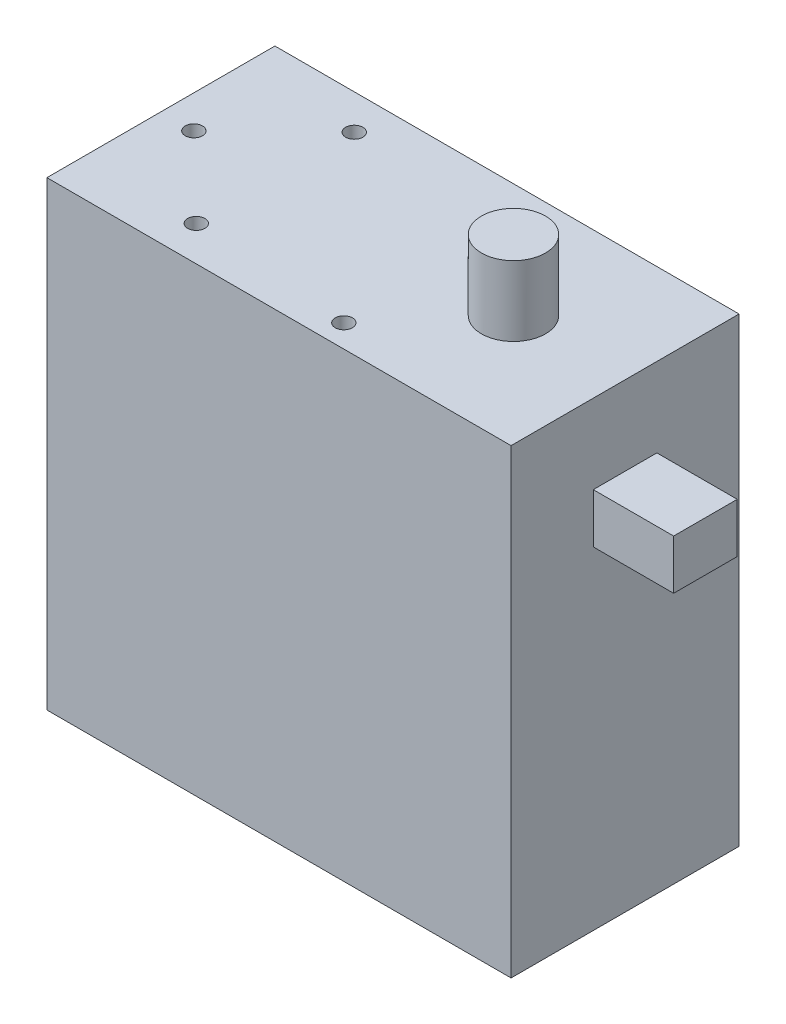
ISO-10303-21;
HEADER;
FILE_DESCRIPTION(('STEP AP214'),'2;1');
FILE_NAME('part.step','',(''),(''),'','','');
FILE_SCHEMA(('AUTOMOTIVE_DESIGN { 1 0 10303 214 1 1 1 1 }'));
ENDSEC;
DATA;
#1=APPLICATION_CONTEXT('core data for automotive mechanical design processes');
#2=APPLICATION_PROTOCOL_DEFINITION('international standard','automotive_design',2000,#1);
#3=PRODUCT_CONTEXT('',#1,'mechanical');
#4=PRODUCT('Part','Part','',(#3));
#5=PRODUCT_RELATED_PRODUCT_CATEGORY('part','',(#4));
#6=PRODUCT_DEFINITION_FORMATION('','',#4);
#7=PRODUCT_DEFINITION_CONTEXT('part definition',#1,'design');
#8=PRODUCT_DEFINITION('design','',#6,#7);
#9=PRODUCT_DEFINITION_SHAPE('','',#8);
#10=(LENGTH_UNIT() NAMED_UNIT(*) SI_UNIT(.MILLI.,.METRE.));
#11=(NAMED_UNIT(*) PLANE_ANGLE_UNIT() SI_UNIT($,.RADIAN.));
#12=(NAMED_UNIT(*) SI_UNIT($,.STERADIAN.) SOLID_ANGLE_UNIT());
#13=UNCERTAINTY_MEASURE_WITH_UNIT(LENGTH_MEASURE(1.E-05),#10,'distance_accuracy_value','');
#14=(GEOMETRIC_REPRESENTATION_CONTEXT(3) GLOBAL_UNCERTAINTY_ASSIGNED_CONTEXT((#13)) GLOBAL_UNIT_ASSIGNED_CONTEXT((#10,
#11,#12)) REPRESENTATION_CONTEXT('',''));
#15=CARTESIAN_POINT('',(0.,0.,0.));
#16=DIRECTION('',(0.,0.,1.));
#17=DIRECTION('',(1.,0.,0.));
#18=AXIS2_PLACEMENT_3D('',#15,#16,#17);
#19=CARTESIAN_POINT('',(40.43,0.,19.86));
#20=DIRECTION('',(-1.,0.,0.));
#21=DIRECTION('',(0.,0.,1.));
#22=AXIS2_PLACEMENT_3D('',#19,#20,#21);
#23=PLANE('',#22);
#24=DIRECTION('',(0.,1.,0.));
#25=VECTOR('',#24,1.);
#26=CARTESIAN_POINT('',(40.43,0.,0.));
#27=LINE('',#26,#25);
#28=CARTESIAN_POINT('',(40.43,0.,0.));
#29=VERTEX_POINT('',#28);
#30=CARTESIAN_POINT('',(40.43,40.16,0.));
#31=VERTEX_POINT('',#30);
#32=EDGE_CURVE('E212',#29,#31,#27,.T.);
#33=ORIENTED_EDGE('',*,*,#32,.T.);
#34=DIRECTION('',(0.,0.,-1.));
#35=VECTOR('',#34,1.);
#36=CARTESIAN_POINT('',(40.43,40.16,19.86));
#37=LINE('',#36,#35);
#38=CARTESIAN_POINT('',(40.43,40.16,19.86));
#39=VERTEX_POINT('',#38);
#40=EDGE_CURVE('E217',#39,#31,#37,.T.);
#41=ORIENTED_EDGE('',*,*,#40,.F.);
#42=DIRECTION('',(0.,1.,0.));
#43=VECTOR('',#42,1.);
#44=CARTESIAN_POINT('',(40.43,0.,19.86));
#45=LINE('',#44,#43);
#46=CARTESIAN_POINT('',(40.43,0.,19.86));
#47=VERTEX_POINT('',#46);
#48=EDGE_CURVE('E203',#47,#39,#45,.T.);
#49=ORIENTED_EDGE('',*,*,#48,.F.);
#50=DIRECTION('',(0.,0.,-1.));
#51=VECTOR('',#50,1.);
#52=CARTESIAN_POINT('',(40.43,0.,19.86));
#53=LINE('',#52,#51);
#54=EDGE_CURVE('E220',#47,#29,#53,.T.);
#55=ORIENTED_EDGE('',*,*,#54,.T.);
#56=EDGE_LOOP('',(#33,#41,#49,#55));
#57=FACE_BOUND('',#56,.T.);
#58=DIRECTION('',(0.,-1.,0.));
#59=VECTOR('',#58,1.);
#60=CARTESIAN_POINT('',(40.43,33.26,12.7));
#61=LINE('',#60,#59);
#62=CARTESIAN_POINT('',(40.43,33.26,12.7));
#63=VERTEX_POINT('',#62);
#64=CARTESIAN_POINT('',(40.43,28.94,12.7));
#65=VERTEX_POINT('',#64);
#66=EDGE_CURVE('E118',#63,#65,#61,.T.);
#67=ORIENTED_EDGE('',*,*,#66,.F.);
#68=DIRECTION('',(0.,0.,1.));
#69=VECTOR('',#68,1.);
#70=CARTESIAN_POINT('',(40.43,33.26,12.7));
#71=LINE('',#70,#69);
#72=CARTESIAN_POINT('',(40.43,33.26,7.16));
#73=VERTEX_POINT('',#72);
#74=EDGE_CURVE('E115',#73,#63,#71,.T.);
#75=ORIENTED_EDGE('',*,*,#74,.F.);
#76=DIRECTION('',(0.,1.,0.));
#77=VECTOR('',#76,1.);
#78=CARTESIAN_POINT('',(40.43,33.26,7.16));
#79=LINE('',#78,#77);
#80=CARTESIAN_POINT('',(40.43,28.94,7.16));
#81=VERTEX_POINT('',#80);
#82=EDGE_CURVE('E53',#81,#73,#79,.T.);
#83=ORIENTED_EDGE('',*,*,#82,.F.);
#84=DIRECTION('',(0.,0.,-1.));
#85=VECTOR('',#84,1.);
#86=CARTESIAN_POINT('',(40.43,28.94,12.7));
#87=LINE('',#86,#85);
#88=EDGE_CURVE('E48',#65,#81,#87,.T.);
#89=ORIENTED_EDGE('',*,*,#88,.F.);
#90=EDGE_LOOP('',(#67,#75,#83,#89));
#91=FACE_BOUND('',#90,.T.);
#92=ADVANCED_FACE('F33',(#57,#91),#23,.F.);
#93=CARTESIAN_POINT('',(0.,0.,19.86));
#94=DIRECTION('',(1.,0.,0.));
#95=DIRECTION('',(0.,0.,-1.));
#96=AXIS2_PLACEMENT_3D('',#93,#94,#95);
#97=PLANE('',#96);
#98=DIRECTION('',(0.,-1.,0.));
#99=VECTOR('',#98,1.);
#100=CARTESIAN_POINT('',(0.,0.,0.));
#101=LINE('',#100,#99);
#102=CARTESIAN_POINT('',(0.,40.16,0.));
#103=VERTEX_POINT('',#102);
#104=CARTESIAN_POINT('',(0.,0.,0.));
#105=VERTEX_POINT('',#104);
#106=EDGE_CURVE('E196',#103,#105,#101,.T.);
#107=ORIENTED_EDGE('',*,*,#106,.T.);
#108=DIRECTION('',(0.,0.,-1.));
#109=VECTOR('',#108,1.);
#110=CARTESIAN_POINT('',(0.,0.,19.86));
#111=LINE('',#110,#109);
#112=CARTESIAN_POINT('',(0.,0.,19.86));
#113=VERTEX_POINT('',#112);
#114=EDGE_CURVE('E223',#113,#105,#111,.T.);
#115=ORIENTED_EDGE('',*,*,#114,.F.);
#116=DIRECTION('',(0.,-1.,0.));
#117=VECTOR('',#116,1.);
#118=CARTESIAN_POINT('',(0.,0.,19.86));
#119=LINE('',#118,#117);
#120=CARTESIAN_POINT('',(0.,40.16,19.86));
#121=VERTEX_POINT('',#120);
#122=EDGE_CURVE('E197',#121,#113,#119,.T.);
#123=ORIENTED_EDGE('',*,*,#122,.F.);
#124=DIRECTION('',(0.,0.,-1.));
#125=VECTOR('',#124,1.);
#126=CARTESIAN_POINT('',(0.,40.16,19.86));
#127=LINE('',#126,#125);
#128=EDGE_CURVE('E207',#121,#103,#127,.T.);
#129=ORIENTED_EDGE('',*,*,#128,.T.);
#130=EDGE_LOOP('',(#107,#115,#123,#129));
#131=FACE_BOUND('',#130,.T.);
#132=ADVANCED_FACE('F35',(#131),#97,.F.);
#133=CARTESIAN_POINT('',(0.,0.,19.86));
#134=DIRECTION('',(0.,1.,0.));
#135=DIRECTION('',(0.,0.,1.));
#136=AXIS2_PLACEMENT_3D('',#133,#134,#135);
#137=PLANE('',#136);
#138=CARTESIAN_POINT('',(38.43,0.,17.86));
#139=DIRECTION('',(0.,-1.,0.));
#140=DIRECTION('',(0.,0.,-1.));
#141=AXIS2_PLACEMENT_3D('',#138,#139,#140);
#142=CIRCLE('',#141,0.749999999999999);
#143=CARTESIAN_POINT('',(38.43,0.,17.11));
#144=VERTEX_POINT('',#143);
#145=EDGE_CURVE('E135',#144,#144,#142,.T.);
#146=ORIENTED_EDGE('',*,*,#145,.F.);
#147=EDGE_LOOP('',(#146));
#148=FACE_BOUND('',#147,.T.);
#149=CARTESIAN_POINT('',(2.07,0.,17.86));
#150=DIRECTION('',(0.,-1.,0.));
#151=DIRECTION('',(0.,0.,-1.));
#152=AXIS2_PLACEMENT_3D('',#149,#150,#151);
#153=CIRCLE('',#152,0.750000000000001);
#154=CARTESIAN_POINT('',(2.07,0.,17.11));
#155=VERTEX_POINT('',#154);
#156=EDGE_CURVE('E141',#155,#155,#153,.T.);
#157=ORIENTED_EDGE('',*,*,#156,.F.);
#158=EDGE_LOOP('',(#157));
#159=FACE_BOUND('',#158,.T.);
#160=CARTESIAN_POINT('',(17.31,0.,2.));
#161=DIRECTION('',(0.,-1.,0.));
#162=DIRECTION('',(0.,0.,-1.));
#163=AXIS2_PLACEMENT_3D('',#160,#161,#162);
#164=CIRCLE('',#163,0.750000000000002);
#165=CARTESIAN_POINT('',(17.31,0.,1.25));
#166=VERTEX_POINT('',#165);
#167=EDGE_CURVE('E147',#166,#166,#164,.T.);
#168=ORIENTED_EDGE('',*,*,#167,.F.);
#169=EDGE_LOOP('',(#168));
#170=FACE_BOUND('',#169,.T.);
#171=CARTESIAN_POINT('',(38.43,0.,2.));
#172=DIRECTION('',(0.,-1.,0.));
#173=DIRECTION('',(0.,0.,-1.));
#174=AXIS2_PLACEMENT_3D('',#171,#172,#173);
#175=CIRCLE('',#174,0.749999999999999);
#176=CARTESIAN_POINT('',(38.43,0.,1.25));
#177=VERTEX_POINT('',#176);
#178=EDGE_CURVE('E129',#177,#177,#175,.T.);
#179=ORIENTED_EDGE('',*,*,#178,.F.);
#180=EDGE_LOOP('',(#179));
#181=FACE_BOUND('',#180,.T.);
#182=CARTESIAN_POINT('',(2.07,0.,2.));
#183=DIRECTION('',(0.,-1.,0.));
#184=DIRECTION('',(0.,0.,-1.));
#185=AXIS2_PLACEMENT_3D('',#182,#183,#184);
#186=CIRCLE('',#185,0.750000000000001);
#187=CARTESIAN_POINT('',(2.07,0.,1.25));
#188=VERTEX_POINT('',#187);
#189=EDGE_CURVE('E119',#188,#188,#186,.T.);
#190=ORIENTED_EDGE('',*,*,#189,.F.);
#191=EDGE_LOOP('',(#190));
#192=FACE_BOUND('',#191,.T.);
#193=CARTESIAN_POINT('',(17.31,0.,17.86));
#194=DIRECTION('',(0.,-1.,0.));
#195=DIRECTION('',(0.,0.,-1.));
#196=AXIS2_PLACEMENT_3D('',#193,#194,#195);
#197=CIRCLE('',#196,0.750000000000002);
#198=CARTESIAN_POINT('',(17.31,0.,17.11));
#199=VERTEX_POINT('',#198);
#200=EDGE_CURVE('E134',#199,#199,#197,.T.);
#201=ORIENTED_EDGE('',*,*,#200,.F.);
#202=EDGE_LOOP('',(#201));
#203=FACE_BOUND('',#202,.T.);
#204=CARTESIAN_POINT('',(30.71,0.,9.93));
#205=DIRECTION('',(0.,1.,0.));
#206=DIRECTION('',(0.,0.,1.));
#207=AXIS2_PLACEMENT_3D('',#204,#205,#206);
#208=CIRCLE('',#207,3.01);
#209=CARTESIAN_POINT('',(30.71,0.,12.94));
#210=VERTEX_POINT('',#209);
#211=EDGE_CURVE('E11',#210,#210,#208,.F.);
#212=ORIENTED_EDGE('',*,*,#211,.F.);
#213=EDGE_LOOP('',(#212));
#214=FACE_BOUND('',#213,.T.);
#215=DIRECTION('',(1.,0.,0.));
#216=VECTOR('',#215,1.);
#217=CARTESIAN_POINT('',(0.,0.,0.));
#218=LINE('',#217,#216);
#219=EDGE_CURVE('E210',#105,#29,#218,.T.);
#220=ORIENTED_EDGE('',*,*,#219,.T.);
#221=ORIENTED_EDGE('',*,*,#54,.F.);
#222=DIRECTION('',(1.,0.,0.));
#223=VECTOR('',#222,1.);
#224=CARTESIAN_POINT('',(0.,0.,19.86));
#225=LINE('',#224,#223);
#226=EDGE_CURVE('E200',#113,#47,#225,.T.);
#227=ORIENTED_EDGE('',*,*,#226,.F.);
#228=ORIENTED_EDGE('',*,*,#114,.T.);
#229=EDGE_LOOP('',(#220,#221,#227,#228));
#230=FACE_BOUND('',#229,.T.);
#231=ADVANCED_FACE('F234',(#148,#159,#170,#181,#192,#203,#214,#230),#137,.F.);
#232=CARTESIAN_POINT('',(0.,40.16,19.86));
#233=DIRECTION('',(0.,-1.,0.));
#234=DIRECTION('',(0.,0.,-1.));
#235=AXIS2_PLACEMENT_3D('',#232,#233,#234);
#236=PLANE('',#235);
#237=CARTESIAN_POINT('',(23.88,40.16,17.88));
#238=DIRECTION('',(0.,1.,0.));
#239=DIRECTION('',(0.,0.,1.));
#240=AXIS2_PLACEMENT_3D('',#237,#238,#239);
#241=CIRCLE('',#240,0.750000000000002);
#242=CARTESIAN_POINT('',(23.88,40.16,18.63));
#243=VERTEX_POINT('',#242);
#244=EDGE_CURVE('E177',#243,#243,#241,.T.);
#245=ORIENTED_EDGE('',*,*,#244,.F.);
#246=EDGE_LOOP('',(#245));
#247=FACE_BOUND('',#246,.T.);
#248=CARTESIAN_POINT('',(2.87,40.16,9.93));
#249=DIRECTION('',(0.,1.,0.));
#250=DIRECTION('',(0.,0.,1.));
#251=AXIS2_PLACEMENT_3D('',#248,#249,#250);
#252=CIRCLE('',#251,0.750000000000001);
#253=CARTESIAN_POINT('',(2.87,40.16,10.68));
#254=VERTEX_POINT('',#253);
#255=EDGE_CURVE('E164',#254,#254,#252,.T.);
#256=ORIENTED_EDGE('',*,*,#255,.F.);
#257=EDGE_LOOP('',(#256));
#258=FACE_BOUND('',#257,.T.);
#259=CARTESIAN_POINT('',(9.96,40.16,3.05));
#260=DIRECTION('',(0.,1.,0.));
#261=DIRECTION('',(0.,0.,1.));
#262=AXIS2_PLACEMENT_3D('',#259,#260,#261);
#263=CIRCLE('',#262,0.75);
#264=CARTESIAN_POINT('',(9.96,40.16,3.8));
#265=VERTEX_POINT('',#264);
#266=EDGE_CURVE('E165',#265,#265,#263,.T.);
#267=ORIENTED_EDGE('',*,*,#266,.F.);
#268=EDGE_LOOP('',(#267));
#269=FACE_BOUND('',#268,.T.);
#270=CARTESIAN_POINT('',(9.96,40.16,16.81));
#271=DIRECTION('',(0.,1.,0.));
#272=DIRECTION('',(0.,0.,1.));
#273=AXIS2_PLACEMENT_3D('',#270,#271,#272);
#274=CIRCLE('',#273,0.75);
#275=CARTESIAN_POINT('',(9.96,40.16,17.56));
#276=VERTEX_POINT('',#275);
#277=EDGE_CURVE('E158',#276,#276,#274,.T.);
#278=ORIENTED_EDGE('',*,*,#277,.F.);
#279=EDGE_LOOP('',(#278));
#280=FACE_BOUND('',#279,.T.);
#281=CARTESIAN_POINT('',(23.88,40.16,1.98));
#282=DIRECTION('',(0.,1.,0.));
#283=DIRECTION('',(0.,0.,1.));
#284=AXIS2_PLACEMENT_3D('',#281,#282,#283);
#285=CIRCLE('',#284,0.750000000000002);
#286=CARTESIAN_POINT('',(23.88,40.16,2.73));
#287=VERTEX_POINT('',#286);
#288=EDGE_CURVE('E176',#287,#287,#285,.T.);
#289=ORIENTED_EDGE('',*,*,#288,.F.);
#290=EDGE_LOOP('',(#289));
#291=FACE_BOUND('',#290,.T.);
#292=CARTESIAN_POINT('',(30.71,40.16,9.93));
#293=DIRECTION('',(0.,-1.,0.));
#294=DIRECTION('',(0.,0.,-1.));
#295=AXIS2_PLACEMENT_3D('',#292,#293,#294);
#296=CIRCLE('',#295,2.79);
#297=CARTESIAN_POINT('',(30.71,40.16,7.14));
#298=VERTEX_POINT('',#297);
#299=EDGE_CURVE('E41',#298,#298,#296,.F.);
#300=ORIENTED_EDGE('',*,*,#299,.F.);
#301=EDGE_LOOP('',(#300));
#302=FACE_BOUND('',#301,.T.);
#303=DIRECTION('',(-1.,0.,0.));
#304=VECTOR('',#303,1.);
#305=CARTESIAN_POINT('',(0.,40.16,0.));
#306=LINE('',#305,#304);
#307=EDGE_CURVE('E201',#31,#103,#306,.T.);
#308=ORIENTED_EDGE('',*,*,#307,.T.);
#309=ORIENTED_EDGE('',*,*,#128,.F.);
#310=DIRECTION('',(-1.,0.,0.));
#311=VECTOR('',#310,1.);
#312=CARTESIAN_POINT('',(0.,40.16,19.86));
#313=LINE('',#312,#311);
#314=EDGE_CURVE('E205',#39,#121,#313,.T.);
#315=ORIENTED_EDGE('',*,*,#314,.F.);
#316=ORIENTED_EDGE('',*,*,#40,.T.);
#317=EDGE_LOOP('',(#308,#309,#315,#316));
#318=FACE_BOUND('',#317,.T.);
#319=ADVANCED_FACE('F230',(#247,#258,#269,#280,#291,#302,#318),#236,.F.);
#320=CARTESIAN_POINT('',(0.,0.,19.86));
#321=DIRECTION('',(0.,0.,-1.));
#322=DIRECTION('',(-1.,0.,0.));
#323=AXIS2_PLACEMENT_3D('',#320,#321,#322);
#324=PLANE('',#323);
#325=ORIENTED_EDGE('',*,*,#122,.T.);
#326=ORIENTED_EDGE('',*,*,#226,.T.);
#327=ORIENTED_EDGE('',*,*,#48,.T.);
#328=ORIENTED_EDGE('',*,*,#314,.T.);
#329=EDGE_LOOP('',(#325,#326,#327,#328));
#330=FACE_BOUND('',#329,.T.);
#331=ADVANCED_FACE('F233',(#330),#324,.F.);
#332=CARTESIAN_POINT('',(0.,0.,0.));
#333=DIRECTION('',(0.,0.,-1.));
#334=DIRECTION('',(-1.,0.,0.));
#335=AXIS2_PLACEMENT_3D('',#332,#333,#334);
#336=PLANE('',#335);
#337=ORIENTED_EDGE('',*,*,#106,.F.);
#338=ORIENTED_EDGE('',*,*,#307,.F.);
#339=ORIENTED_EDGE('',*,*,#32,.F.);
#340=ORIENTED_EDGE('',*,*,#219,.F.);
#341=EDGE_LOOP('',(#337,#338,#339,#340));
#342=FACE_BOUND('',#341,.T.);
#343=ADVANCED_FACE('F247',(#342),#336,.T.);
#344=CARTESIAN_POINT('',(30.71,46.26,9.93));
#345=DIRECTION('',(0.,-1.,0.));
#346=DIRECTION('',(0.,0.,-1.));
#347=AXIS2_PLACEMENT_3D('',#344,#345,#346);
#348=CYLINDRICAL_SURFACE('',#347,2.79);
#349=CARTESIAN_POINT('',(30.71,46.26,9.93));
#350=DIRECTION('',(0.,1.,0.));
#351=DIRECTION('',(0.,0.,1.));
#352=AXIS2_PLACEMENT_3D('',#349,#350,#351);
#353=CIRCLE('',#352,2.79);
#354=CARTESIAN_POINT('',(30.71,46.26,12.72));
#355=VERTEX_POINT('',#354);
#356=EDGE_CURVE('E193',#355,#355,#353,.T.);
#357=ORIENTED_EDGE('',*,*,#356,.F.);
#358=EDGE_LOOP('',(#357));
#359=FACE_BOUND('',#358,.T.);
#360=ORIENTED_EDGE('',*,*,#299,.T.);
#361=EDGE_LOOP('',(#360));
#362=FACE_BOUND('',#361,.T.);
#363=ADVANCED_FACE('F228',(#359,#362),#348,.T.);
#364=CARTESIAN_POINT('',(30.71,46.26,9.93));
#365=DIRECTION('',(0.,1.,0.));
#366=DIRECTION('',(0.,0.,1.));
#367=AXIS2_PLACEMENT_3D('',#364,#365,#366);
#368=PLANE('',#367);
#369=ORIENTED_EDGE('',*,*,#356,.T.);
#370=EDGE_LOOP('',(#369));
#371=FACE_BOUND('',#370,.T.);
#372=ADVANCED_FACE('F377',(#371),#368,.T.);
#373=CARTESIAN_POINT('',(30.71,-5.5,9.93));
#374=DIRECTION('',(0.,1.,0.));
#375=DIRECTION('',(0.,0.,1.));
#376=AXIS2_PLACEMENT_3D('',#373,#374,#375);
#377=CYLINDRICAL_SURFACE('',#376,3.01);
#378=CARTESIAN_POINT('',(30.71,-5.5,9.93));
#379=DIRECTION('',(0.,-1.,0.));
#380=DIRECTION('',(0.,0.,-1.));
#381=AXIS2_PLACEMENT_3D('',#378,#379,#380);
#382=CIRCLE('',#381,3.01);
#383=CARTESIAN_POINT('',(30.71,-5.5,6.92));
#384=VERTEX_POINT('',#383);
#385=EDGE_CURVE('E188',#384,#384,#382,.T.);
#386=ORIENTED_EDGE('',*,*,#385,.F.);
#387=EDGE_LOOP('',(#386));
#388=FACE_BOUND('',#387,.T.);
#389=ORIENTED_EDGE('',*,*,#211,.T.);
#390=EDGE_LOOP('',(#389));
#391=FACE_BOUND('',#390,.T.);
#392=ADVANCED_FACE('F373',(#388,#391),#377,.T.);
#393=CARTESIAN_POINT('',(30.71,-5.5,9.93));
#394=DIRECTION('',(0.,-1.,0.));
#395=DIRECTION('',(0.,0.,-1.));
#396=AXIS2_PLACEMENT_3D('',#393,#394,#395);
#397=PLANE('',#396);
#398=ORIENTED_EDGE('',*,*,#385,.T.);
#399=EDGE_LOOP('',(#398));
#400=FACE_BOUND('',#399,.T.);
#401=ADVANCED_FACE('F369',(#400),#397,.T.);
#402=CARTESIAN_POINT('',(23.88,38.16,1.98));
#403=DIRECTION('',(0.,1.,0.));
#404=DIRECTION('',(0.,0.,1.));
#405=AXIS2_PLACEMENT_3D('',#402,#403,#404);
#406=CYLINDRICAL_SURFACE('',#405,0.750000000000002);
#407=CARTESIAN_POINT('',(23.88,38.16,1.98));
#408=DIRECTION('',(0.,1.,0.));
#409=DIRECTION('',(0.,0.,1.));
#410=AXIS2_PLACEMENT_3D('',#407,#408,#409);
#411=CIRCLE('',#410,0.750000000000002);
#412=CARTESIAN_POINT('',(23.88,38.16,2.73));
#413=VERTEX_POINT('',#412);
#414=EDGE_CURVE('E185',#413,#413,#411,.T.);
#415=ORIENTED_EDGE('',*,*,#414,.F.);
#416=EDGE_LOOP('',(#415));
#417=FACE_BOUND('',#416,.T.);
#418=ORIENTED_EDGE('',*,*,#288,.T.);
#419=EDGE_LOOP('',(#418));
#420=FACE_BOUND('',#419,.T.);
#421=ADVANCED_FACE('F365',(#417,#420),#406,.F.);
#422=CARTESIAN_POINT('',(23.88,38.16,1.98));
#423=DIRECTION('',(0.,1.,0.));
#424=DIRECTION('',(0.,0.,1.));
#425=AXIS2_PLACEMENT_3D('',#422,#423,#424);
#426=PLANE('',#425);
#427=ORIENTED_EDGE('',*,*,#414,.T.);
#428=EDGE_LOOP('',(#427));
#429=FACE_BOUND('',#428,.T.);
#430=ADVANCED_FACE('F347',(#429),#426,.T.);
#431=CARTESIAN_POINT('',(9.96,38.16,16.81));
#432=DIRECTION('',(0.,1.,0.));
#433=DIRECTION('',(0.,0.,1.));
#434=AXIS2_PLACEMENT_3D('',#431,#432,#433);
#435=CYLINDRICAL_SURFACE('',#434,0.75);
#436=CARTESIAN_POINT('',(9.96,38.16,16.81));
#437=DIRECTION('',(0.,1.,0.));
#438=DIRECTION('',(0.,0.,1.));
#439=AXIS2_PLACEMENT_3D('',#436,#437,#438);
#440=CIRCLE('',#439,0.75);
#441=CARTESIAN_POINT('',(9.96,38.16,17.56));
#442=VERTEX_POINT('',#441);
#443=EDGE_CURVE('E168',#442,#442,#440,.T.);
#444=ORIENTED_EDGE('',*,*,#443,.F.);
#445=EDGE_LOOP('',(#444));
#446=FACE_BOUND('',#445,.T.);
#447=ORIENTED_EDGE('',*,*,#277,.T.);
#448=EDGE_LOOP('',(#447));
#449=FACE_BOUND('',#448,.T.);
#450=ADVANCED_FACE('F343',(#446,#449),#435,.F.);
#451=CARTESIAN_POINT('',(9.96,38.16,16.81));
#452=DIRECTION('',(0.,1.,0.));
#453=DIRECTION('',(0.,0.,1.));
#454=AXIS2_PLACEMENT_3D('',#451,#452,#453);
#455=PLANE('',#454);
#456=ORIENTED_EDGE('',*,*,#443,.T.);
#457=EDGE_LOOP('',(#456));
#458=FACE_BOUND('',#457,.T.);
#459=ADVANCED_FACE('F339',(#458),#455,.T.);
#460=CARTESIAN_POINT('',(9.96,38.16,3.05));
#461=DIRECTION('',(0.,1.,0.));
#462=DIRECTION('',(0.,0.,1.));
#463=AXIS2_PLACEMENT_3D('',#460,#461,#462);
#464=CYLINDRICAL_SURFACE('',#463,0.75);
#465=CARTESIAN_POINT('',(9.96,38.16,3.05));
#466=DIRECTION('',(0.,1.,0.));
#467=DIRECTION('',(0.,0.,1.));
#468=AXIS2_PLACEMENT_3D('',#465,#466,#467);
#469=CIRCLE('',#468,0.75);
#470=CARTESIAN_POINT('',(9.96,38.16,3.8));
#471=VERTEX_POINT('',#470);
#472=EDGE_CURVE('E161',#471,#471,#469,.T.);
#473=ORIENTED_EDGE('',*,*,#472,.F.);
#474=EDGE_LOOP('',(#473));
#475=FACE_BOUND('',#474,.T.);
#476=ORIENTED_EDGE('',*,*,#266,.T.);
#477=EDGE_LOOP('',(#476));
#478=FACE_BOUND('',#477,.T.);
#479=ADVANCED_FACE('F335',(#475,#478),#464,.F.);
#480=CARTESIAN_POINT('',(9.96,38.16,3.05));
#481=DIRECTION('',(0.,1.,0.));
#482=DIRECTION('',(0.,0.,1.));
#483=AXIS2_PLACEMENT_3D('',#480,#481,#482);
#484=PLANE('',#483);
#485=ORIENTED_EDGE('',*,*,#472,.T.);
#486=EDGE_LOOP('',(#485));
#487=FACE_BOUND('',#486,.T.);
#488=ADVANCED_FACE('F331',(#487),#484,.T.);
#489=CARTESIAN_POINT('',(2.87,38.16,9.93));
#490=DIRECTION('',(0.,1.,0.));
#491=DIRECTION('',(0.,0.,1.));
#492=AXIS2_PLACEMENT_3D('',#489,#490,#491);
#493=CYLINDRICAL_SURFACE('',#492,0.750000000000001);
#494=CARTESIAN_POINT('',(2.87,38.16,9.93));
#495=DIRECTION('',(0.,1.,0.));
#496=DIRECTION('',(0.,0.,1.));
#497=AXIS2_PLACEMENT_3D('',#494,#495,#496);
#498=CIRCLE('',#497,0.750000000000001);
#499=CARTESIAN_POINT('',(2.87,38.16,10.68));
#500=VERTEX_POINT('',#499);
#501=EDGE_CURVE('E180',#500,#500,#498,.T.);
#502=ORIENTED_EDGE('',*,*,#501,.F.);
#503=EDGE_LOOP('',(#502));
#504=FACE_BOUND('',#503,.T.);
#505=ORIENTED_EDGE('',*,*,#255,.T.);
#506=EDGE_LOOP('',(#505));
#507=FACE_BOUND('',#506,.T.);
#508=ADVANCED_FACE('F334',(#504,#507),#493,.F.);
#509=CARTESIAN_POINT('',(2.87,38.16,9.93));
#510=DIRECTION('',(0.,1.,0.));
#511=DIRECTION('',(0.,0.,1.));
#512=AXIS2_PLACEMENT_3D('',#509,#510,#511);
#513=PLANE('',#512);
#514=ORIENTED_EDGE('',*,*,#501,.T.);
#515=EDGE_LOOP('',(#514));
#516=FACE_BOUND('',#515,.T.);
#517=ADVANCED_FACE('F355',(#516),#513,.T.);
#518=CARTESIAN_POINT('',(23.88,38.16,17.88));
#519=DIRECTION('',(0.,1.,0.));
#520=DIRECTION('',(0.,0.,1.));
#521=AXIS2_PLACEMENT_3D('',#518,#519,#520);
#522=CYLINDRICAL_SURFACE('',#521,0.750000000000002);
#523=CARTESIAN_POINT('',(23.88,38.16,17.88));
#524=DIRECTION('',(0.,1.,0.));
#525=DIRECTION('',(0.,0.,1.));
#526=AXIS2_PLACEMENT_3D('',#523,#524,#525);
#527=CIRCLE('',#526,0.750000000000002);
#528=CARTESIAN_POINT('',(23.88,38.16,18.63));
#529=VERTEX_POINT('',#528);
#530=EDGE_CURVE('E173',#529,#529,#527,.T.);
#531=ORIENTED_EDGE('',*,*,#530,.F.);
#532=EDGE_LOOP('',(#531));
#533=FACE_BOUND('',#532,.T.);
#534=ORIENTED_EDGE('',*,*,#244,.T.);
#535=EDGE_LOOP('',(#534));
#536=FACE_BOUND('',#535,.T.);
#537=ADVANCED_FACE('F351',(#533,#536),#522,.F.);
#538=CARTESIAN_POINT('',(23.88,38.16,17.88));
#539=DIRECTION('',(0.,1.,0.));
#540=DIRECTION('',(0.,0.,1.));
#541=AXIS2_PLACEMENT_3D('',#538,#539,#540);
#542=PLANE('',#541);
#543=ORIENTED_EDGE('',*,*,#530,.T.);
#544=EDGE_LOOP('',(#543));
#545=FACE_BOUND('',#544,.T.);
#546=ADVANCED_FACE('F329',(#545),#542,.T.);
#547=CARTESIAN_POINT('',(17.31,2.,17.86));
#548=DIRECTION('',(0.,-1.,0.));
#549=DIRECTION('',(0.,0.,-1.));
#550=AXIS2_PLACEMENT_3D('',#547,#548,#549);
#551=CYLINDRICAL_SURFACE('',#550,0.750000000000002);
#552=CARTESIAN_POINT('',(17.31,2.,17.86));
#553=DIRECTION('',(0.,-1.,0.));
#554=DIRECTION('',(0.,0.,-1.));
#555=AXIS2_PLACEMENT_3D('',#552,#553,#554);
#556=CIRCLE('',#555,0.750000000000002);
#557=CARTESIAN_POINT('',(17.31,2.,17.11));
#558=VERTEX_POINT('',#557);
#559=EDGE_CURVE('E155',#558,#558,#556,.T.);
#560=ORIENTED_EDGE('',*,*,#559,.F.);
#561=EDGE_LOOP('',(#560));
#562=FACE_BOUND('',#561,.T.);
#563=ORIENTED_EDGE('',*,*,#200,.T.);
#564=EDGE_LOOP('',(#563));
#565=FACE_BOUND('',#564,.T.);
#566=ADVANCED_FACE('F325',(#562,#565),#551,.F.);
#567=CARTESIAN_POINT('',(17.31,2.,17.86));
#568=DIRECTION('',(0.,-1.,0.));
#569=DIRECTION('',(0.,0.,-1.));
#570=AXIS2_PLACEMENT_3D('',#567,#568,#569);
#571=PLANE('',#570);
#572=ORIENTED_EDGE('',*,*,#559,.T.);
#573=EDGE_LOOP('',(#572));
#574=FACE_BOUND('',#573,.T.);
#575=ADVANCED_FACE('F291',(#574),#571,.T.);
#576=CARTESIAN_POINT('',(2.07,2.,2.));
#577=DIRECTION('',(0.,-1.,0.));
#578=DIRECTION('',(0.,0.,-1.));
#579=AXIS2_PLACEMENT_3D('',#576,#577,#578);
#580=CYLINDRICAL_SURFACE('',#579,0.750000000000001);
#581=CARTESIAN_POINT('',(2.07,2.,2.));
#582=DIRECTION('',(0.,-1.,0.));
#583=DIRECTION('',(0.,0.,-1.));
#584=AXIS2_PLACEMENT_3D('',#581,#582,#583);
#585=CIRCLE('',#584,0.750000000000001);
#586=CARTESIAN_POINT('',(2.07,2.,1.25));
#587=VERTEX_POINT('',#586);
#588=EDGE_CURVE('E122',#587,#587,#585,.T.);
#589=ORIENTED_EDGE('',*,*,#588,.F.);
#590=EDGE_LOOP('',(#589));
#591=FACE_BOUND('',#590,.T.);
#592=ORIENTED_EDGE('',*,*,#189,.T.);
#593=EDGE_LOOP('',(#592));
#594=FACE_BOUND('',#593,.T.);
#595=ADVANCED_FACE('F287',(#591,#594),#580,.F.);
#596=CARTESIAN_POINT('',(2.07,2.,2.));
#597=DIRECTION('',(0.,-1.,0.));
#598=DIRECTION('',(0.,0.,-1.));
#599=AXIS2_PLACEMENT_3D('',#596,#597,#598);
#600=PLANE('',#599);
#601=ORIENTED_EDGE('',*,*,#588,.T.);
#602=EDGE_LOOP('',(#601));
#603=FACE_BOUND('',#602,.T.);
#604=ADVANCED_FACE('F283',(#603),#600,.T.);
#605=CARTESIAN_POINT('',(38.43,2.,2.));
#606=DIRECTION('',(0.,-1.,0.));
#607=DIRECTION('',(0.,0.,-1.));
#608=AXIS2_PLACEMENT_3D('',#605,#606,#607);
#609=CYLINDRICAL_SURFACE('',#608,0.749999999999999);
#610=CARTESIAN_POINT('',(38.43,2.,2.));
#611=DIRECTION('',(0.,-1.,0.));
#612=DIRECTION('',(0.,0.,-1.));
#613=AXIS2_PLACEMENT_3D('',#610,#611,#612);
#614=CIRCLE('',#613,0.749999999999999);
#615=CARTESIAN_POINT('',(38.43,2.,1.25));
#616=VERTEX_POINT('',#615);
#617=EDGE_CURVE('E150',#616,#616,#614,.T.);
#618=ORIENTED_EDGE('',*,*,#617,.F.);
#619=EDGE_LOOP('',(#618));
#620=FACE_BOUND('',#619,.T.);
#621=ORIENTED_EDGE('',*,*,#178,.T.);
#622=EDGE_LOOP('',(#621));
#623=FACE_BOUND('',#622,.T.);
#624=ADVANCED_FACE('F286',(#620,#623),#609,.F.);
#625=CARTESIAN_POINT('',(38.43,2.,2.));
#626=DIRECTION('',(0.,-1.,0.));
#627=DIRECTION('',(0.,0.,-1.));
#628=AXIS2_PLACEMENT_3D('',#625,#626,#627);
#629=PLANE('',#628);
#630=ORIENTED_EDGE('',*,*,#617,.T.);
#631=EDGE_LOOP('',(#630));
#632=FACE_BOUND('',#631,.T.);
#633=ADVANCED_FACE('F315',(#632),#629,.T.);
#634=CARTESIAN_POINT('',(17.31,2.,2.));
#635=DIRECTION('',(0.,-1.,0.));
#636=DIRECTION('',(0.,0.,-1.));
#637=AXIS2_PLACEMENT_3D('',#634,#635,#636);
#638=CYLINDRICAL_SURFACE('',#637,0.750000000000002);
#639=CARTESIAN_POINT('',(17.31,2.,2.));
#640=DIRECTION('',(0.,-1.,0.));
#641=DIRECTION('',(0.,0.,-1.));
#642=AXIS2_PLACEMENT_3D('',#639,#640,#641);
#643=CIRCLE('',#642,0.750000000000002);
#644=CARTESIAN_POINT('',(17.31,2.,1.25));
#645=VERTEX_POINT('',#644);
#646=EDGE_CURVE('E144',#645,#645,#643,.T.);
#647=ORIENTED_EDGE('',*,*,#646,.F.);
#648=EDGE_LOOP('',(#647));
#649=FACE_BOUND('',#648,.T.);
#650=ORIENTED_EDGE('',*,*,#167,.T.);
#651=EDGE_LOOP('',(#650));
#652=FACE_BOUND('',#651,.T.);
#653=ADVANCED_FACE('F311',(#649,#652),#638,.F.);
#654=CARTESIAN_POINT('',(17.31,2.,2.));
#655=DIRECTION('',(0.,-1.,0.));
#656=DIRECTION('',(0.,0.,-1.));
#657=AXIS2_PLACEMENT_3D('',#654,#655,#656);
#658=PLANE('',#657);
#659=ORIENTED_EDGE('',*,*,#646,.T.);
#660=EDGE_LOOP('',(#659));
#661=FACE_BOUND('',#660,.T.);
#662=ADVANCED_FACE('F307',(#661),#658,.T.);
#663=CARTESIAN_POINT('',(2.07,2.,17.86));
#664=DIRECTION('',(0.,-1.,0.));
#665=DIRECTION('',(0.,0.,-1.));
#666=AXIS2_PLACEMENT_3D('',#663,#664,#665);
#667=CYLINDRICAL_SURFACE('',#666,0.750000000000001);
#668=CARTESIAN_POINT('',(2.07,2.,17.86));
#669=DIRECTION('',(0.,-1.,0.));
#670=DIRECTION('',(0.,0.,-1.));
#671=AXIS2_PLACEMENT_3D('',#668,#669,#670);
#672=CIRCLE('',#671,0.750000000000001);
#673=CARTESIAN_POINT('',(2.07,2.,17.11));
#674=VERTEX_POINT('',#673);
#675=EDGE_CURVE('E138',#674,#674,#672,.T.);
#676=ORIENTED_EDGE('',*,*,#675,.F.);
#677=EDGE_LOOP('',(#676));
#678=FACE_BOUND('',#677,.T.);
#679=ORIENTED_EDGE('',*,*,#156,.T.);
#680=EDGE_LOOP('',(#679));
#681=FACE_BOUND('',#680,.T.);
#682=ADVANCED_FACE('F303',(#678,#681),#667,.F.);
#683=CARTESIAN_POINT('',(2.07,2.,17.86));
#684=DIRECTION('',(0.,-1.,0.));
#685=DIRECTION('',(0.,0.,-1.));
#686=AXIS2_PLACEMENT_3D('',#683,#684,#685);
#687=PLANE('',#686);
#688=ORIENTED_EDGE('',*,*,#675,.T.);
#689=EDGE_LOOP('',(#688));
#690=FACE_BOUND('',#689,.T.);
#691=ADVANCED_FACE('F299',(#690),#687,.T.);
#692=CARTESIAN_POINT('',(38.43,2.,17.86));
#693=DIRECTION('',(0.,-1.,0.));
#694=DIRECTION('',(0.,0.,-1.));
#695=AXIS2_PLACEMENT_3D('',#692,#693,#694);
#696=CYLINDRICAL_SURFACE('',#695,0.749999999999999);
#697=CARTESIAN_POINT('',(38.43,2.,17.86));
#698=DIRECTION('',(0.,-1.,0.));
#699=DIRECTION('',(0.,0.,-1.));
#700=AXIS2_PLACEMENT_3D('',#697,#698,#699);
#701=CIRCLE('',#700,0.749999999999999);
#702=CARTESIAN_POINT('',(38.43,2.,17.11));
#703=VERTEX_POINT('',#702);
#704=EDGE_CURVE('E131',#703,#703,#701,.T.);
#705=ORIENTED_EDGE('',*,*,#704,.F.);
#706=EDGE_LOOP('',(#705));
#707=FACE_BOUND('',#706,.T.);
#708=ORIENTED_EDGE('',*,*,#145,.T.);
#709=EDGE_LOOP('',(#708));
#710=FACE_BOUND('',#709,.T.);
#711=ADVANCED_FACE('F295',(#707,#710),#696,.F.);
#712=CARTESIAN_POINT('',(38.43,2.,17.86));
#713=DIRECTION('',(0.,-1.,0.));
#714=DIRECTION('',(0.,0.,-1.));
#715=AXIS2_PLACEMENT_3D('',#712,#713,#714);
#716=PLANE('',#715);
#717=ORIENTED_EDGE('',*,*,#704,.T.);
#718=EDGE_LOOP('',(#717));
#719=FACE_BOUND('',#718,.T.);
#720=ADVANCED_FACE('F282',(#719),#716,.T.);
#721=CARTESIAN_POINT('',(47.43,33.26,12.7));
#722=DIRECTION('',(0.,0.,-1.));
#723=DIRECTION('',(-1.,0.,0.));
#724=AXIS2_PLACEMENT_3D('',#721,#722,#723);
#725=PLANE('',#724);
#726=ORIENTED_EDGE('',*,*,#66,.T.);
#727=DIRECTION('',(-1.,0.,0.));
#728=VECTOR('',#727,1.);
#729=CARTESIAN_POINT('',(47.43,28.94,12.7));
#730=LINE('',#729,#728);
#731=CARTESIAN_POINT('',(47.43,28.94,12.7));
#732=VERTEX_POINT('',#731);
#733=EDGE_CURVE('E99',#732,#65,#730,.T.);
#734=ORIENTED_EDGE('',*,*,#733,.F.);
#735=DIRECTION('',(0.,-1.,0.));
#736=VECTOR('',#735,1.);
#737=CARTESIAN_POINT('',(47.43,33.26,12.7));
#738=LINE('',#737,#736);
#739=CARTESIAN_POINT('',(47.43,33.26,12.7));
#740=VERTEX_POINT('',#739);
#741=EDGE_CURVE('E106',#740,#732,#738,.T.);
#742=ORIENTED_EDGE('',*,*,#741,.F.);
#743=DIRECTION('',(-1.,0.,0.));
#744=VECTOR('',#743,1.);
#745=CARTESIAN_POINT('',(47.43,33.26,12.7));
#746=LINE('',#745,#744);
#747=EDGE_CURVE('E260',#740,#63,#746,.T.);
#748=ORIENTED_EDGE('',*,*,#747,.T.);
#749=EDGE_LOOP('',(#726,#734,#742,#748));
#750=FACE_BOUND('',#749,.T.);
#751=ADVANCED_FACE('F117',(#750),#725,.F.);
#752=CARTESIAN_POINT('',(47.43,28.94,12.7));
#753=DIRECTION('',(0.,1.,0.));
#754=DIRECTION('',(0.,0.,1.));
#755=AXIS2_PLACEMENT_3D('',#752,#753,#754);
#756=PLANE('',#755);
#757=ORIENTED_EDGE('',*,*,#88,.T.);
#758=DIRECTION('',(-1.,0.,0.));
#759=VECTOR('',#758,1.);
#760=CARTESIAN_POINT('',(47.43,28.94,7.16));
#761=LINE('',#760,#759);
#762=CARTESIAN_POINT('',(47.43,28.94,7.16));
#763=VERTEX_POINT('',#762);
#764=EDGE_CURVE('E102',#763,#81,#761,.T.);
#765=ORIENTED_EDGE('',*,*,#764,.F.);
#766=DIRECTION('',(0.,0.,-1.));
#767=VECTOR('',#766,1.);
#768=CARTESIAN_POINT('',(47.43,28.94,12.7));
#769=LINE('',#768,#767);
#770=EDGE_CURVE('E95',#732,#763,#769,.T.);
#771=ORIENTED_EDGE('',*,*,#770,.F.);
#772=ORIENTED_EDGE('',*,*,#733,.T.);
#773=EDGE_LOOP('',(#757,#765,#771,#772));
#774=FACE_BOUND('',#773,.T.);
#775=ADVANCED_FACE('F97',(#774),#756,.F.);
#776=CARTESIAN_POINT('',(47.43,33.26,7.16));
#777=DIRECTION('',(0.,0.,1.));
#778=DIRECTION('',(0.,-1.,0.));
#779=AXIS2_PLACEMENT_3D('',#776,#777,#778);
#780=PLANE('',#779);
#781=ORIENTED_EDGE('',*,*,#82,.T.);
#782=DIRECTION('',(-1.,0.,0.));
#783=VECTOR('',#782,1.);
#784=CARTESIAN_POINT('',(47.43,33.26,7.16));
#785=LINE('',#784,#783);
#786=CARTESIAN_POINT('',(47.43,33.26,7.16));
#787=VERTEX_POINT('',#786);
#788=EDGE_CURVE('E124',#787,#73,#785,.T.);
#789=ORIENTED_EDGE('',*,*,#788,.F.);
#790=DIRECTION('',(0.,1.,0.));
#791=VECTOR('',#790,1.);
#792=CARTESIAN_POINT('',(47.43,33.26,7.16));
#793=LINE('',#792,#791);
#794=EDGE_CURVE('E105',#763,#787,#793,.T.);
#795=ORIENTED_EDGE('',*,*,#794,.F.);
#796=ORIENTED_EDGE('',*,*,#764,.T.);
#797=EDGE_LOOP('',(#781,#789,#795,#796));
#798=FACE_BOUND('',#797,.T.);
#799=ADVANCED_FACE('F269',(#798),#780,.F.);
#800=CARTESIAN_POINT('',(47.43,33.26,12.7));
#801=DIRECTION('',(0.,-1.,0.));
#802=DIRECTION('',(0.,0.,-1.));
#803=AXIS2_PLACEMENT_3D('',#800,#801,#802);
#804=PLANE('',#803);
#805=ORIENTED_EDGE('',*,*,#74,.T.);
#806=ORIENTED_EDGE('',*,*,#747,.F.);
#807=DIRECTION('',(0.,0.,1.));
#808=VECTOR('',#807,1.);
#809=CARTESIAN_POINT('',(47.43,33.26,12.7));
#810=LINE('',#809,#808);
#811=EDGE_CURVE('E111',#787,#740,#810,.T.);
#812=ORIENTED_EDGE('',*,*,#811,.F.);
#813=ORIENTED_EDGE('',*,*,#788,.T.);
#814=EDGE_LOOP('',(#805,#806,#812,#813));
#815=FACE_BOUND('',#814,.T.);
#816=ADVANCED_FACE('F259',(#815),#804,.F.);
#817=CARTESIAN_POINT('',(47.43,0.,0.));
#818=DIRECTION('',(1.,0.,0.));
#819=DIRECTION('',(0.,0.,-1.));
#820=AXIS2_PLACEMENT_3D('',#817,#818,#819);
#821=PLANE('',#820);
#822=ORIENTED_EDGE('',*,*,#741,.T.);
#823=ORIENTED_EDGE('',*,*,#770,.T.);
#824=ORIENTED_EDGE('',*,*,#794,.T.);
#825=ORIENTED_EDGE('',*,*,#811,.T.);
#826=EDGE_LOOP('',(#822,#823,#824,#825));
#827=FACE_BOUND('',#826,.T.);
#828=ADVANCED_FACE('F109',(#827),#821,.T.);
#829=CLOSED_SHELL('',(#92,#132,#231,#319,#331,#343,#363,#372,#392,#401,#421,#430,#450,#459,#479,
#488,#508,#517,#537,#546,#566,#575,#595,#604,#624,#633,#653,#662,#682,#691,#711,#720,#751,#775,
#799,#816,#828));
#830=MANIFOLD_SOLID_BREP('B2',#829);
#831=ADVANCED_BREP_SHAPE_REPRESENTATION('',(#18,#830),#14);
#832=SHAPE_DEFINITION_REPRESENTATION(#9,#831);
ENDSEC;
END-ISO-10303-21;
